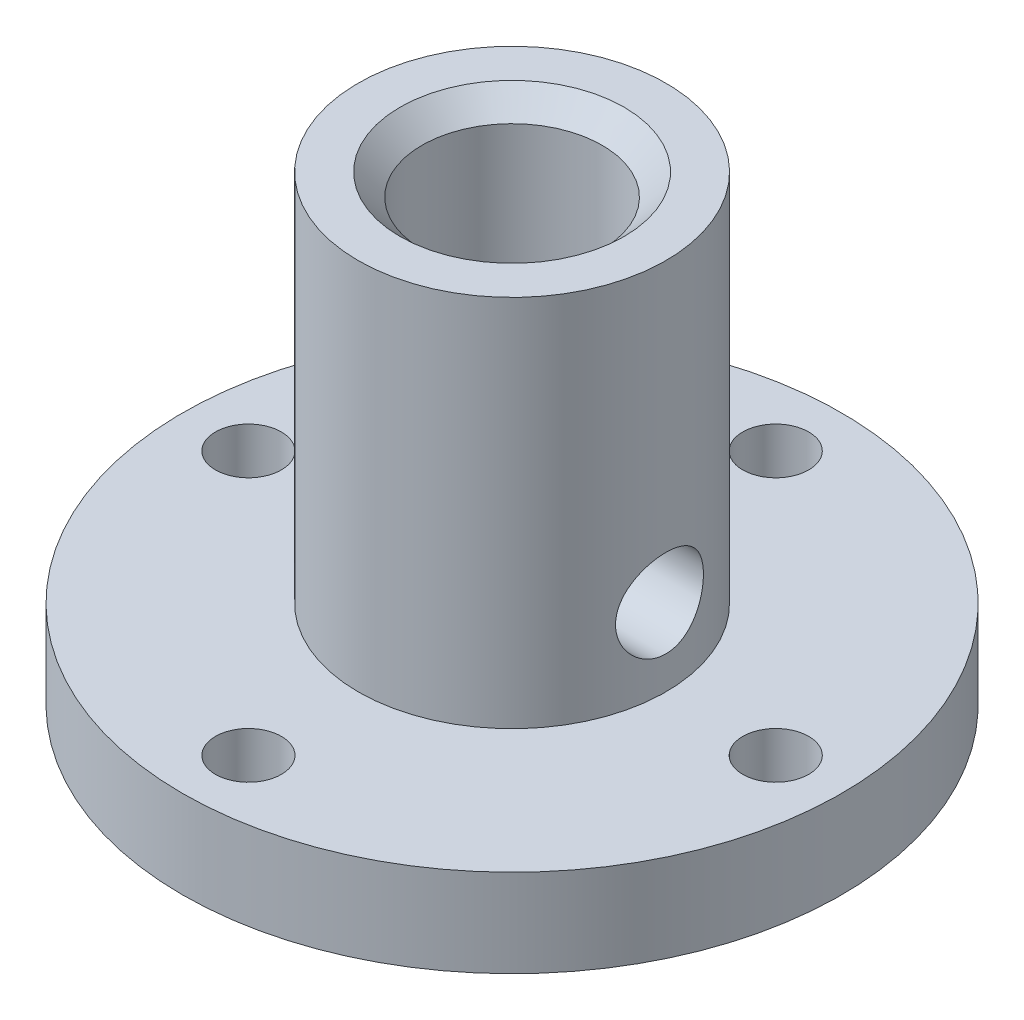
ISO-10303-21;
HEADER;
FILE_DESCRIPTION(('STEP AP214'),'2;1');
FILE_NAME('part.step','',(''),(''),'','','');
FILE_SCHEMA(('AUTOMOTIVE_DESIGN { 1 0 10303 214 1 1 1 1 }'));
ENDSEC;
DATA;
#1=APPLICATION_CONTEXT('core data for automotive mechanical design processes');
#2=APPLICATION_PROTOCOL_DEFINITION('international standard','automotive_design',2000,#1);
#3=PRODUCT_CONTEXT('',#1,'mechanical');
#4=PRODUCT('Part','Part','',(#3));
#5=PRODUCT_RELATED_PRODUCT_CATEGORY('part','',(#4));
#6=PRODUCT_DEFINITION_FORMATION('','',#4);
#7=PRODUCT_DEFINITION_CONTEXT('part definition',#1,'design');
#8=PRODUCT_DEFINITION('design','',#6,#7);
#9=PRODUCT_DEFINITION_SHAPE('','',#8);
#10=(LENGTH_UNIT() NAMED_UNIT(*) SI_UNIT(.MILLI.,.METRE.));
#11=(NAMED_UNIT(*) PLANE_ANGLE_UNIT() SI_UNIT($,.RADIAN.));
#12=(NAMED_UNIT(*) SI_UNIT($,.STERADIAN.) SOLID_ANGLE_UNIT());
#13=UNCERTAINTY_MEASURE_WITH_UNIT(LENGTH_MEASURE(1.E-05),#10,'distance_accuracy_value','');
#14=(GEOMETRIC_REPRESENTATION_CONTEXT(3) GLOBAL_UNCERTAINTY_ASSIGNED_CONTEXT((#13)) GLOBAL_UNIT_ASSIGNED_CONTEXT((#10,
#11,#12)) REPRESENTATION_CONTEXT('',''));
#15=CARTESIAN_POINT('',(0.,0.,0.));
#16=DIRECTION('',(0.,0.,1.));
#17=DIRECTION('',(1.,0.,0.));
#18=AXIS2_PLACEMENT_3D('',#15,#16,#17);
#19=CARTESIAN_POINT('',(0.,4.,0.));
#20=DIRECTION('',(0.,1.,0.));
#21=DIRECTION('',(0.,0.,1.));
#22=AXIS2_PLACEMENT_3D('',#19,#20,#21);
#23=PLANE('',#22);
#24=CARTESIAN_POINT('',(12.,4.,1.25693328198353E-13));
#25=DIRECTION('',(0.,1.,0.));
#26=DIRECTION('',(0.,0.,1.));
#27=AXIS2_PLACEMENT_3D('',#24,#25,#26);
#28=CIRCLE('',#27,1.5);
#29=CARTESIAN_POINT('',(12.,4.,1.50000000000013));
#30=VERTEX_POINT('',#29);
#31=EDGE_CURVE('E263',#30,#30,#28,.T.);
#32=ORIENTED_EDGE('',*,*,#31,.F.);
#33=EDGE_LOOP('',(#32));
#34=FACE_BOUND('',#33,.T.);
#35=CARTESIAN_POINT('',(0.,4.,12.));
#36=DIRECTION('',(0.,1.,0.));
#37=DIRECTION('',(0.,0.,1.));
#38=AXIS2_PLACEMENT_3D('',#35,#36,#37);
#39=CIRCLE('',#38,1.5);
#40=CARTESIAN_POINT('',(0.,4.,13.5));
#41=VERTEX_POINT('',#40);
#42=EDGE_CURVE('E259',#41,#41,#39,.T.);
#43=ORIENTED_EDGE('',*,*,#42,.F.);
#44=EDGE_LOOP('',(#43));
#45=FACE_BOUND('',#44,.T.);
#46=CARTESIAN_POINT('',(-12.,4.,0.));
#47=DIRECTION('',(0.,1.,0.));
#48=DIRECTION('',(0.,0.,1.));
#49=AXIS2_PLACEMENT_3D('',#46,#47,#48);
#50=CIRCLE('',#49,1.5);
#51=CARTESIAN_POINT('',(-12.,4.,1.49999999999996));
#52=VERTEX_POINT('',#51);
#53=EDGE_CURVE('E249',#52,#52,#50,.T.);
#54=ORIENTED_EDGE('',*,*,#53,.F.);
#55=EDGE_LOOP('',(#54));
#56=FACE_BOUND('',#55,.T.);
#57=CARTESIAN_POINT('',(0.,4.,-12.));
#58=DIRECTION('',(0.,1.,0.));
#59=DIRECTION('',(0.,0.,1.));
#60=AXIS2_PLACEMENT_3D('',#57,#58,#59);
#61=CIRCLE('',#60,1.5);
#62=CARTESIAN_POINT('',(0.,4.,-10.5));
#63=VERTEX_POINT('',#62);
#64=EDGE_CURVE('E242',#63,#63,#61,.T.);
#65=ORIENTED_EDGE('',*,*,#64,.F.);
#66=EDGE_LOOP('',(#65));
#67=FACE_BOUND('',#66,.T.);
#68=CARTESIAN_POINT('',(0.,4.,0.));
#69=DIRECTION('',(0.,1.,0.));
#70=DIRECTION('',(0.,0.,1.));
#71=AXIS2_PLACEMENT_3D('',#68,#69,#70);
#72=CIRCLE('',#71,15.);
#73=CARTESIAN_POINT('',(0.,4.,15.));
#74=VERTEX_POINT('',#73);
#75=EDGE_CURVE('E62',#74,#74,#72,.T.);
#76=ORIENTED_EDGE('',*,*,#75,.T.);
#77=EDGE_LOOP('',(#76));
#78=FACE_BOUND('',#77,.T.);
#79=CARTESIAN_POINT('',(0.,4.,0.));
#80=DIRECTION('',(0.,1.,0.));
#81=DIRECTION('',(0.,0.,1.));
#82=AXIS2_PLACEMENT_3D('',#79,#80,#81);
#83=CIRCLE('',#82,7.);
#84=CARTESIAN_POINT('',(0.,4.,7.));
#85=VERTEX_POINT('',#84);
#86=EDGE_CURVE('E102',#85,#85,#83,.T.);
#87=ORIENTED_EDGE('',*,*,#86,.F.);
#88=EDGE_LOOP('',(#87));
#89=FACE_BOUND('',#88,.T.);
#90=ADVANCED_FACE('F49',(#34,#45,#56,#67,#78,#89),#23,.T.);
#91=CARTESIAN_POINT('',(0.,0.,0.));
#92=DIRECTION('',(0.,1.,0.));
#93=DIRECTION('',(0.,0.,1.));
#94=AXIS2_PLACEMENT_3D('',#91,#92,#93);
#95=PLANE('',#94);
#96=CARTESIAN_POINT('',(12.,0.,1.25693328198353E-13));
#97=DIRECTION('',(0.,1.,0.));
#98=DIRECTION('',(0.,0.,1.));
#99=AXIS2_PLACEMENT_3D('',#96,#97,#98);
#100=CIRCLE('',#99,1.5);
#101=CARTESIAN_POINT('',(12.,0.,1.50000000000013));
#102=VERTEX_POINT('',#101);
#103=EDGE_CURVE('E80',#102,#102,#100,.T.);
#104=ORIENTED_EDGE('',*,*,#103,.T.);
#105=EDGE_LOOP('',(#104));
#106=FACE_BOUND('',#105,.T.);
#107=CARTESIAN_POINT('',(0.,0.,12.));
#108=DIRECTION('',(0.,1.,0.));
#109=DIRECTION('',(0.,0.,1.));
#110=AXIS2_PLACEMENT_3D('',#107,#108,#109);
#111=CIRCLE('',#110,1.5);
#112=CARTESIAN_POINT('',(0.,0.,13.5));
#113=VERTEX_POINT('',#112);
#114=EDGE_CURVE('E255',#113,#113,#111,.T.);
#115=ORIENTED_EDGE('',*,*,#114,.T.);
#116=EDGE_LOOP('',(#115));
#117=FACE_BOUND('',#116,.T.);
#118=CARTESIAN_POINT('',(-12.,0.,0.));
#119=DIRECTION('',(0.,1.,0.));
#120=DIRECTION('',(0.,0.,1.));
#121=AXIS2_PLACEMENT_3D('',#118,#119,#120);
#122=CIRCLE('',#121,1.5);
#123=CARTESIAN_POINT('',(-12.,0.,1.49999999999996));
#124=VERTEX_POINT('',#123);
#125=EDGE_CURVE('E245',#124,#124,#122,.T.);
#126=ORIENTED_EDGE('',*,*,#125,.T.);
#127=EDGE_LOOP('',(#126));
#128=FACE_BOUND('',#127,.T.);
#129=CARTESIAN_POINT('',(0.,0.,-12.));
#130=DIRECTION('',(0.,1.,0.));
#131=DIRECTION('',(0.,0.,1.));
#132=AXIS2_PLACEMENT_3D('',#129,#130,#131);
#133=CIRCLE('',#132,1.5);
#134=CARTESIAN_POINT('',(0.,0.,-10.5));
#135=VERTEX_POINT('',#134);
#136=EDGE_CURVE('E103',#135,#135,#133,.T.);
#137=ORIENTED_EDGE('',*,*,#136,.T.);
#138=EDGE_LOOP('',(#137));
#139=FACE_BOUND('',#138,.T.);
#140=CARTESIAN_POINT('',(0.,0.,0.));
#141=DIRECTION('',(0.,1.,0.));
#142=DIRECTION('',(0.,0.,1.));
#143=AXIS2_PLACEMENT_3D('',#140,#141,#142);
#144=CIRCLE('',#143,15.);
#145=CARTESIAN_POINT('',(0.,0.,15.));
#146=VERTEX_POINT('',#145);
#147=EDGE_CURVE('E67',#146,#146,#144,.T.);
#148=ORIENTED_EDGE('',*,*,#147,.F.);
#149=EDGE_LOOP('',(#148));
#150=FACE_BOUND('',#149,.T.);
#151=CARTESIAN_POINT('',(0.,0.,0.));
#152=DIRECTION('',(0.,1.,0.));
#153=DIRECTION('',(0.,0.,1.));
#154=AXIS2_PLACEMENT_3D('',#151,#152,#153);
#155=CIRCLE('',#154,4.1);
#156=CARTESIAN_POINT('',(0.,0.,4.1));
#157=VERTEX_POINT('',#156);
#158=EDGE_CURVE('E129',#157,#157,#155,.T.);
#159=ORIENTED_EDGE('',*,*,#158,.T.);
#160=EDGE_LOOP('',(#159));
#161=FACE_BOUND('',#160,.T.);
#162=ADVANCED_FACE('F114',(#106,#117,#128,#139,#150,#161),#95,.F.);
#163=CARTESIAN_POINT('',(0.,4.,0.));
#164=DIRECTION('',(0.,-1.,0.));
#165=DIRECTION('',(0.,0.,-1.));
#166=AXIS2_PLACEMENT_3D('',#163,#164,#165);
#167=CYLINDRICAL_SURFACE('',#166,15.);
#168=ORIENTED_EDGE('',*,*,#75,.F.);
#169=EDGE_LOOP('',(#168));
#170=FACE_BOUND('',#169,.T.);
#171=ORIENTED_EDGE('',*,*,#147,.T.);
#172=EDGE_LOOP('',(#171));
#173=FACE_BOUND('',#172,.T.);
#174=ADVANCED_FACE('F111',(#170,#173),#167,.T.);
#175=CARTESIAN_POINT('',(0.,4.,0.));
#176=DIRECTION('',(0.,-1.,0.));
#177=DIRECTION('',(0.,0.,-1.));
#178=AXIS2_PLACEMENT_3D('',#175,#176,#177);
#179=CYLINDRICAL_SURFACE('',#178,4.1);
#180=CARTESIAN_POINT('',(0.,20.,0.));
#181=DIRECTION('',(0.,1.,0.));
#182=DIRECTION('',(0.,0.,1.));
#183=AXIS2_PLACEMENT_3D('',#180,#181,#182);
#184=CIRCLE('',#183,4.1);
#185=CARTESIAN_POINT('',(0.,20.,4.1));
#186=VERTEX_POINT('',#185);
#187=EDGE_CURVE('E57',#186,#186,#184,.T.);
#188=ORIENTED_EDGE('',*,*,#187,.T.);
#189=EDGE_LOOP('',(#188));
#190=FACE_BOUND('',#189,.T.);
#191=CARTESIAN_POINT('',(3.57910603363466,7.5,2.));
#192=CARTESIAN_POINT('',(3.57911549351938,7.60460313127252,1.99999203521137));
#193=CARTESIAN_POINT('',(3.58376125840516,7.70935110339454,1.99173874982166));
#194=CARTESIAN_POINT('',(3.60168515917494,7.91566130495392,1.95912946894205));
#195=CARTESIAN_POINT('',(3.61498231102066,8.01721599877448,1.93473799932171));
#196=CARTESIAN_POINT('',(3.64830431376547,8.21377250616725,1.87113477427495));
#197=CARTESIAN_POINT('',(3.66829469181402,8.30880494978369,1.83199883213511));
#198=CARTESIAN_POINT('',(3.71269796582502,8.49093185949433,1.74024799841703));
#199=CARTESIAN_POINT('',(3.73711091358427,8.5780262326005,1.68763294896955));
#200=CARTESIAN_POINT('',(3.78994762967,8.74934330237854,1.56558293033315));
#201=CARTESIAN_POINT('',(3.81853577179174,8.83280721222689,1.49515355486));
#202=CARTESIAN_POINT('',(3.87517206142575,8.98732403060545,1.34154519168277));
#203=CARTESIAN_POINT('',(3.90321994472343,9.05837099717957,1.25836013547559));
#204=CARTESIAN_POINT('',(3.95774408872127,9.19043951249541,1.07515162671652));
#205=CARTESIAN_POINT('',(3.98400796365301,9.25053985458591,0.974394981339268));
#206=CARTESIAN_POINT('',(4.02989043804658,9.35259316855004,0.762680850328952));
#207=CARTESIAN_POINT('',(4.04951303191397,9.39455705283757,0.651729547528795));
#208=CARTESIAN_POINT('',(4.07872062370044,9.4561813505541,0.430804292426906));
#209=CARTESIAN_POINT('',(4.08889945801618,9.4771688968046,0.321280788621115));
#210=CARTESIAN_POINT('',(4.10028036474683,9.5006026099949,0.0998294816190987));
#211=CARTESIAN_POINT('',(4.10148757147755,9.50305938180604,-0.01209690965444));
#212=CARTESIAN_POINT('',(4.09508161202062,9.48990297628252,-0.225251375571962));
#213=CARTESIAN_POINT('',(4.08819107596985,9.47577033524335,-0.326597393919667));
#214=CARTESIAN_POINT('',(4.06744064579331,9.43246824246255,-0.525265987252532));
#215=CARTESIAN_POINT('',(4.05358023200027,9.40329766950335,-0.622588261645648));
#216=CARTESIAN_POINT('',(4.01992124886936,9.33052427018978,-0.812185586111151));
#217=CARTESIAN_POINT('',(4.0000405126708,9.28672081777833,-0.904368438528104));
#218=CARTESIAN_POINT('',(3.95615659362404,9.1861846505913,-1.08030473735587));
#219=CARTESIAN_POINT('',(3.93215191572606,9.12944724443096,-1.16405510921946));
#220=CARTESIAN_POINT('',(3.87971757201288,8.99870432864888,-1.32888526806237));
#221=CARTESIAN_POINT('',(3.85108400972904,8.92359657959063,-1.40902672648122));
#222=CARTESIAN_POINT('',(3.79405881442221,8.76121417466934,-1.55606875729569));
#223=CARTESIAN_POINT('',(3.76566736542168,8.67393101134308,-1.6229599914329));
#224=CARTESIAN_POINT('',(3.71057327831189,8.4834283131435,-1.74539879244378));
#225=CARTESIAN_POINT('',(3.68406522126376,8.37957678754232,-1.80005910768764));
#226=CARTESIAN_POINT('',(3.6383756600965,8.16254531299001,-1.89072122831643));
#227=CARTESIAN_POINT('',(3.61918683229938,8.04937482729991,-1.92674169782092));
#228=CARTESIAN_POINT('',(3.5923718224711,7.8262170381446,-1.97626037678829));
#229=CARTESIAN_POINT('',(3.58396173722362,7.71666788748898,-1.99129373139044));
#230=CARTESIAN_POINT('',(3.57741810990285,7.49631416397176,-2.00303207769182));
#231=CARTESIAN_POINT('',(3.57927807326091,7.3855104287216,-1.99974865253435));
#232=CARTESIAN_POINT('',(3.59223528636872,7.17777840015293,-1.97635544891226));
#233=CARTESIAN_POINT('',(3.60237445078161,7.08058447947523,-1.95798980802438));
#234=CARTESIAN_POINT('',(3.6293610990874,6.89082470684055,-1.90749863988995));
#235=CARTESIAN_POINT('',(3.64621063043137,6.79826027713433,-1.87536891275174));
#236=CARTESIAN_POINT('',(3.68564393156237,6.61551488543606,-1.79667570758733));
#237=CARTESIAN_POINT('',(3.70845762353666,6.52564414575372,-1.74951132085546));
#238=CARTESIAN_POINT('',(3.75702564086069,6.35458219102223,-1.64262069707828));
#239=CARTESIAN_POINT('',(3.78278145981906,6.27339542536318,-1.58288806653124));
#240=CARTESIAN_POINT('',(3.83801172380996,6.11192249694563,-1.44425233541737));
#241=CARTESIAN_POINT('',(3.86756445509084,6.03288901011393,-1.36391485049048));
#242=CARTESIAN_POINT('',(3.92438084705234,5.88905777574575,-1.1906082774667));
#243=CARTESIAN_POINT('',(3.95164384841493,5.82426411988422,-1.09763557115075));
#244=CARTESIAN_POINT('',(4.0015960231227,5.70961039790442,-0.898856284576327));
#245=CARTESIAN_POINT('',(4.02417294714763,5.66010539262237,-0.79281474568715));
#246=CARTESIAN_POINT('',(4.06136575959817,5.58011586984284,-0.572492505839614));
#247=CARTESIAN_POINT('',(4.07598830059589,5.54961545492327,-0.458218780662893));
#248=CARTESIAN_POINT('',(4.09460950167294,5.51100997434092,-0.235637779143147));
#249=CARTESIAN_POINT('',(4.09943655344915,5.50115608424858,-0.127702309747682));
#250=CARTESIAN_POINT('',(4.10046910319513,5.49903732350476,0.0883674499714201));
#251=CARTESIAN_POINT('',(4.09667733157617,5.50676688248247,0.196501666488732));
#252=CARTESIAN_POINT('',(4.081380862921,5.53840850821583,0.403000999714159));
#253=CARTESIAN_POINT('',(4.07035869803276,5.56130900695535,0.501560522153557));
#254=CARTESIAN_POINT('',(4.04212024074726,5.6213208863698,0.69329740677902));
#255=CARTESIAN_POINT('',(4.02490301779979,5.6584344020142,0.786473957955667));
#256=CARTESIAN_POINT('',(3.98490151452439,5.74754675796046,0.969387107444829));
#257=CARTESIAN_POINT('',(3.96190565673567,5.80012858458626,1.05879207441146));
#258=CARTESIAN_POINT('',(3.91280606992116,5.91793833015936,1.22789007126321));
#259=CARTESIAN_POINT('',(3.88670091268204,5.98317206929789,1.30757860376514));
#260=CARTESIAN_POINT('',(3.83108076584123,6.13166030819632,1.46296322006605));
#261=CARTESIAN_POINT('',(3.80147771479893,6.21603903377536,1.53755746285946));
#262=CARTESIAN_POINT('',(3.74434364653043,6.39661515273092,1.67189420349916));
#263=CARTESIAN_POINT('',(3.71681432796668,6.49282206878541,1.73162461618753));
#264=CARTESIAN_POINT('',(3.66655946796521,6.69769988709364,1.83569855861032));
#265=CARTESIAN_POINT('',(3.64396779323184,6.80661796714086,1.87963029930495));
#266=CARTESIAN_POINT('',(3.61694115748607,6.97525215827044,1.93082838173293));
#267=CARTESIAN_POINT('',(3.60907981766962,7.0322852370427,1.94543783106175));
#268=CARTESIAN_POINT('',(3.59594892415105,7.14769087021839,1.969605058563));
#269=CARTESIAN_POINT('',(3.59067752771889,7.20606244125187,1.97916642877747));
#270=CARTESIAN_POINT('',(3.58426923449856,7.3037857828507,1.99073876092795));
#271=CARTESIAN_POINT('',(3.58233773716366,7.34292007089391,1.99420822373664));
#272=CARTESIAN_POINT('',(3.57975431873891,7.42136274052758,1.99884041200608));
#273=CARTESIAN_POINT('',(3.57910247689074,7.46067113274827,2.00000299461509));
#274=CARTESIAN_POINT('',(3.57910603363466,7.5,2.));
#275=B_SPLINE_CURVE_WITH_KNOTS('',3,(#191,#192,#193,#194,#195,#196,#197,#198,#199,#200,#201,
#202,#203,#204,#205,#206,#207,#208,#209,#210,#211,#212,#213,#214,#215,#216,#217,#218,#219,#220,
#221,#222,#223,#224,#225,#226,#227,#228,#229,#230,#231,#232,#233,#234,#235,#236,#237,#238,#239,
#240,#241,#242,#243,#244,#245,#246,#247,#248,#249,#250,#251,#252,#253,#254,#255,#256,#257,#258,
#259,#260,#261,#262,#263,#264,#265,#266,#267,#268,#269,#270,#271,#272,#273,#274),.UNSPECIFIED.,
.T.,.F.,(4,2,2,2,2,2,2,2,2,2,2,2,2,2,2,2,2,2,2,2,2,2,2,2,2,2,2,2,2,2,2,2,2,2,2,2,2,2,2,2,2,4),
(0.,0.313650890541303,0.627993533225417,0.940741468656521,1.25349306720364,1.5907325199367,
1.92813291467276,2.28692480669026,2.64550051785586,2.97959497055994,3.31349821173604,
3.61973181129304,3.9259882467137,4.23662887726973,4.54738236272926,4.88644508088654,
5.22574591406521,5.58480245391705,5.94349877057147,6.27426859261931,6.6048292665636,
6.90179199962346,7.19884541074499,7.50969135282915,7.82069580710552,8.16864543025316,
8.51669490295158,8.87230668332232,9.22762059213174,9.55136951175941,9.87501588322538,
10.1790016024625,10.4830330020053,10.8004387428756,11.1179908460248,11.4657662790126,
11.8138235565093,12.1703884153887,12.3483459844256,12.5261767536391,12.6440964591989,
12.7620234666165),.UNSPECIFIED.);
#276=CARTESIAN_POINT('',(3.57910603363466,7.5,2.));
#277=VERTEX_POINT('',#276);
#278=EDGE_CURVE('E79',#277,#277,#275,.T.);
#279=ORIENTED_EDGE('',*,*,#278,.F.);
#280=EDGE_LOOP('',(#279));
#281=FACE_BOUND('',#280,.T.);
#282=ORIENTED_EDGE('',*,*,#158,.F.);
#283=EDGE_LOOP('',(#282));
#284=FACE_BOUND('',#283,.T.);
#285=ADVANCED_FACE('F107',(#190,#281,#284),#179,.F.);
#286=CARTESIAN_POINT('',(0.,21.,0.));
#287=DIRECTION('',(0.,1.,0.));
#288=DIRECTION('',(0.,0.,1.));
#289=AXIS2_PLACEMENT_3D('',#286,#287,#288);
#290=PLANE('',#289);
#291=CARTESIAN_POINT('',(0.,21.,0.));
#292=DIRECTION('',(0.,1.,0.));
#293=DIRECTION('',(0.,0.,1.));
#294=AXIS2_PLACEMENT_3D('',#291,#292,#293);
#295=CIRCLE('',#294,5.10000000000001);
#296=CARTESIAN_POINT('',(0.,21.,5.10000000000001));
#297=VERTEX_POINT('',#296);
#298=EDGE_CURVE('E11',#297,#297,#295,.F.);
#299=ORIENTED_EDGE('',*,*,#298,.T.);
#300=EDGE_LOOP('',(#299));
#301=FACE_BOUND('',#300,.T.);
#302=CARTESIAN_POINT('',(0.,21.,0.));
#303=DIRECTION('',(0.,1.,0.));
#304=DIRECTION('',(0.,0.,1.));
#305=AXIS2_PLACEMENT_3D('',#302,#303,#304);
#306=CIRCLE('',#305,7.);
#307=CARTESIAN_POINT('',(0.,21.,7.));
#308=VERTEX_POINT('',#307);
#309=EDGE_CURVE('E105',#308,#308,#306,.T.);
#310=ORIENTED_EDGE('',*,*,#309,.T.);
#311=EDGE_LOOP('',(#310));
#312=FACE_BOUND('',#311,.T.);
#313=ADVANCED_FACE('F92',(#301,#312),#290,.T.);
#314=CARTESIAN_POINT('',(0.,21.,0.));
#315=DIRECTION('',(0.,-1.,0.));
#316=DIRECTION('',(0.,0.,-1.));
#317=AXIS2_PLACEMENT_3D('',#314,#315,#316);
#318=CYLINDRICAL_SURFACE('',#317,7.);
#319=CARTESIAN_POINT('',(6.70820393249937,7.5,2.));
#320=CARTESIAN_POINT('',(6.70820547009708,7.60985153787724,1.99999802046393));
#321=CARTESIAN_POINT('',(6.71093179679208,7.71972308425451,1.9909186659955));
#322=CARTESIAN_POINT('',(6.72150389207102,7.93627123886298,1.95492363390195));
#323=CARTESIAN_POINT('',(6.72935174296489,8.04294652910063,1.92800070136334));
#324=CARTESIAN_POINT('',(6.74920709521546,8.2499372008715,1.85729343292867));
#325=CARTESIAN_POINT('',(6.76120815257369,8.35026215181714,1.81353520651874));
#326=CARTESIAN_POINT('',(6.78800921096146,8.54216781155437,1.71048364062938));
#327=CARTESIAN_POINT('',(6.80280954425194,8.63374748037804,1.65118845666347));
#328=CARTESIAN_POINT('',(6.83401783214154,8.80819156531483,1.51692480098199));
#329=CARTESIAN_POINT('',(6.8504575596415,8.89076780212922,1.4415892111325));
#330=CARTESIAN_POINT('',(6.88281965512018,9.04230278330379,1.27817124546927));
#331=CARTESIAN_POINT('',(6.89874196233652,9.11125993312284,1.19008737915963));
#332=CARTESIAN_POINT('',(6.92863332001512,9.23482864835352,1.00164603215759));
#333=CARTESIAN_POINT('',(6.94256054500866,9.28914961975098,0.901090783761869));
#334=CARTESIAN_POINT('',(6.96652540485531,9.38000177441597,0.691808475239642));
#335=CARTESIAN_POINT('',(6.97656379690866,9.41653642124027,0.583083010875174));
#336=CARTESIAN_POINT('',(6.99139519300235,9.46983446123971,0.36355857512118));
#337=CARTESIAN_POINT('',(6.99631827011303,9.48708902170467,0.252887798129042));
#338=CARTESIAN_POINT('',(7.00082095659694,9.50288673388324,0.0301201024219257));
#339=CARTESIAN_POINT('',(7.00040158738982,9.50143346233736,-0.0819765395885465));
#340=CARTESIAN_POINT('',(6.99436006763307,9.48019362508198,-0.300980195735219));
#341=CARTESIAN_POINT('',(6.98888870776051,9.46093838736202,-0.407943546108944));
#342=CARTESIAN_POINT('',(6.97353886330137,9.40550489753563,-0.617052222177616));
#343=CARTESIAN_POINT('',(6.96366011056224,9.36932561573788,-0.719197254300508));
#344=CARTESIAN_POINT('',(6.94039031772111,9.28069059918818,-0.917073833728922));
#345=CARTESIAN_POINT('',(6.92696205512133,9.22806122219167,-1.01272304385077));
#346=CARTESIAN_POINT('',(6.89802768974041,9.10815541360198,-1.19400724359048));
#347=CARTESIAN_POINT('',(6.8825211319195,9.04087577233352,-1.27964003241601));
#348=CARTESIAN_POINT('',(6.85045683019623,8.89079428938141,-1.44163264854775));
#349=CARTESIAN_POINT('',(6.83388129369387,8.80753056639495,-1.51756157758489));
#350=CARTESIAN_POINT('',(6.80202973786992,8.62928490815404,-1.65449301574976));
#351=CARTESIAN_POINT('',(6.78675382405366,8.534302023051,-1.71549431378261));
#352=CARTESIAN_POINT('',(6.75915174814409,8.33426911550201,-1.82123335985447));
#353=CARTESIAN_POINT('',(6.74685010938643,8.22914477494834,-1.86583737788771));
#354=CARTESIAN_POINT('',(6.72688544387341,8.01244683649538,-1.9365895149609));
#355=CARTESIAN_POINT('',(6.71922106753542,7.90087512534009,-1.9627430040271));
#356=CARTESIAN_POINT('',(6.70969115196194,7.67851957566769,-1.99507417199885));
#357=CARTESIAN_POINT('',(6.70763711316669,7.56783818306699,-2.00190148157354));
#358=CARTESIAN_POINT('',(6.7090415959684,7.34691168407904,-1.99718996719665));
#359=CARTESIAN_POINT('',(6.71249942992568,7.23666652498908,-1.98565343424642));
#360=CARTESIAN_POINT('',(6.72435430053723,7.02235877197705,-1.94511781425928));
#361=CARTESIAN_POINT('',(6.73263642965451,6.91821241398484,-1.9165246218414));
#362=CARTESIAN_POINT('',(6.75309063930731,6.71619812800227,-1.84315161866429));
#363=CARTESIAN_POINT('',(6.7652632811114,6.61833110835435,-1.79836947226768));
#364=CARTESIAN_POINT('',(6.79250188009389,6.42897792478326,-1.69261965121623));
#365=CARTESIAN_POINT('',(6.80763197381122,6.33770955579781,-1.63127891729131));
#366=CARTESIAN_POINT('',(6.83893726549831,6.16652362655664,-1.49460463684842));
#367=CARTESIAN_POINT('',(6.85511268947611,6.08660853298787,-1.41926805768137));
#368=CARTESIAN_POINT('',(6.88734727436087,5.93762058171182,-1.25370800996556));
#369=CARTESIAN_POINT('',(6.90338406046143,5.86900502858127,-1.16306771024055));
#370=CARTESIAN_POINT('',(6.93297977045999,5.74795431861727,-0.971185307057546));
#371=CARTESIAN_POINT('',(6.94653882385412,5.69551831607762,-0.869943758098184));
#372=CARTESIAN_POINT('',(6.96956504846406,5.60881571297367,-0.660433272956167));
#373=CARTESIAN_POINT('',(6.97906308127248,5.57441161041385,-0.552224799899635));
#374=CARTESIAN_POINT('',(6.99303339623885,5.52437319805982,-0.331245648549923));
#375=CARTESIAN_POINT('',(6.99750697123019,5.50873405981868,-0.218476151585438));
#376=CARTESIAN_POINT('',(7.00085335003284,5.49700856600221,0.00417823795902836));
#377=CARTESIAN_POINT('',(6.99991703588995,5.50025585091718,0.114025631049956));
#378=CARTESIAN_POINT('',(6.99299069122135,5.52463828141029,0.331545172422003));
#379=CARTESIAN_POINT('',(6.98700090270593,5.54577257038204,0.439217424617531));
#380=CARTESIAN_POINT('',(6.97068801860116,5.60493136097885,0.648404133039587));
#381=CARTESIAN_POINT('',(6.96040414048174,5.64280317894398,0.749965033435049));
#382=CARTESIAN_POINT('',(6.93657094143453,5.73422615828548,0.945347202761461));
#383=CARTESIAN_POINT('',(6.92302111501785,5.78777974709225,1.03916727058068));
#384=CARTESIAN_POINT('',(6.89358955440188,5.91089733742482,1.21943345635391));
#385=CARTESIAN_POINT('',(6.8776504578623,5.98089008678841,1.30557732800707));
#386=CARTESIAN_POINT('',(6.84544064986529,6.13410912545394,1.46512122231839));
#387=CARTESIAN_POINT('',(6.82916984787116,6.21733907108483,1.5385177121898));
#388=CARTESIAN_POINT('',(6.79764037543869,6.39729691699546,1.67240846029126));
#389=CARTESIAN_POINT('',(6.78241951768489,6.49432194750348,1.73251316723594));
#390=CARTESIAN_POINT('',(6.7552844533164,6.69752186531463,1.83547943619619));
#391=CARTESIAN_POINT('',(6.74336839719835,6.80369159108834,1.8783506488486));
#392=CARTESIAN_POINT('',(6.72558459556592,7.00765370023266,1.94098534012467));
#393=CARTESIAN_POINT('',(6.71912438833989,7.10469034810252,1.96305899981724));
#394=CARTESIAN_POINT('',(6.71043369466525,7.30114611835192,1.99256607043695));
#395=CARTESIAN_POINT('',(6.70820254070055,7.4005648622311,2.00000179183146));
#396=CARTESIAN_POINT('',(6.70820393249937,7.5,2.));
#397=B_SPLINE_CURVE_WITH_KNOTS('',3,(#319,#320,#321,#322,#323,#324,#325,#326,#327,#328,#329,
#330,#331,#332,#333,#334,#335,#336,#337,#338,#339,#340,#341,#342,#343,#344,#345,#346,#347,#348,
#349,#350,#351,#352,#353,#354,#355,#356,#357,#358,#359,#360,#361,#362,#363,#364,#365,#366,#367,
#368,#369,#370,#371,#372,#373,#374,#375,#376,#377,#378,#379,#380,#381,#382,#383,#384,#385,#386,
#387,#388,#389,#390,#391,#392,#393,#394,#395,#396),.UNSPECIFIED.,.T.,.F.,(4,2,2,2,2,2,2,2,2,2,2,
2,2,2,2,2,2,2,2,2,2,2,2,2,2,2,2,2,2,2,2,2,2,2,2,2,2,2,4),(0.,0.329188342363952,
0.658510609618862,0.987324183736437,1.31617681100735,1.65357167206616,1.99100601238483,
2.33471483013846,2.67835669017706,3.01302901028742,3.34763734552418,3.67257037643421,
3.99752317946522,4.32602903378491,4.65460693184835,4.99471612693,5.3348529062976,
5.67770520630006,6.02045767793012,6.35154363333481,6.6825882869845,7.00605289656512,
7.32956419216041,7.66108006042382,7.99266784620105,8.33545388376657,8.67822200084648,
9.0183368529809,9.35836417076638,9.6864689768406,10.0145580709057,10.3397141238921,
10.6649205354322,10.9997976874537,11.3347674991531,11.6785361242131,12.0221119721565,
12.3201328886649,12.61810676147),.UNSPECIFIED.);
#398=CARTESIAN_POINT('',(6.70820393249937,7.5,2.));
#399=VERTEX_POINT('',#398);
#400=EDGE_CURVE('E70',#399,#399,#397,.T.);
#401=ORIENTED_EDGE('',*,*,#400,.T.);
#402=EDGE_LOOP('',(#401));
#403=FACE_BOUND('',#402,.T.);
#404=ORIENTED_EDGE('',*,*,#309,.F.);
#405=EDGE_LOOP('',(#404));
#406=FACE_BOUND('',#405,.T.);
#407=ORIENTED_EDGE('',*,*,#86,.T.);
#408=EDGE_LOOP('',(#407));
#409=FACE_BOUND('',#408,.T.);
#410=ADVANCED_FACE('F81',(#403,#406,#409),#318,.T.);
#411=CARTESIAN_POINT('',(12.,7.5,0.));
#412=DIRECTION('',(-1.,0.,0.));
#413=DIRECTION('',(0.,0.,1.));
#414=AXIS2_PLACEMENT_3D('',#411,#412,#413);
#415=CYLINDRICAL_SURFACE('',#414,2.);
#416=ORIENTED_EDGE('',*,*,#278,.T.);
#417=EDGE_LOOP('',(#416));
#418=FACE_BOUND('',#417,.T.);
#419=ORIENTED_EDGE('',*,*,#400,.F.);
#420=EDGE_LOOP('',(#419));
#421=FACE_BOUND('',#420,.T.);
#422=ADVANCED_FACE('F85',(#418,#421),#415,.F.);
#423=CARTESIAN_POINT('',(0.,0.,-12.));
#424=DIRECTION('',(0.,1.,0.));
#425=DIRECTION('',(0.,0.,1.));
#426=AXIS2_PLACEMENT_3D('',#423,#424,#425);
#427=CYLINDRICAL_SURFACE('',#426,1.5);
#428=ORIENTED_EDGE('',*,*,#136,.F.);
#429=EDGE_LOOP('',(#428));
#430=FACE_BOUND('',#429,.T.);
#431=ORIENTED_EDGE('',*,*,#64,.T.);
#432=EDGE_LOOP('',(#431));
#433=FACE_BOUND('',#432,.T.);
#434=ADVANCED_FACE('F89',(#430,#433),#427,.F.);
#435=CARTESIAN_POINT('',(-12.,0.,0.));
#436=DIRECTION('',(0.,1.,0.));
#437=DIRECTION('',(0.,0.,1.));
#438=AXIS2_PLACEMENT_3D('',#435,#436,#437);
#439=CYLINDRICAL_SURFACE('',#438,1.5);
#440=ORIENTED_EDGE('',*,*,#125,.F.);
#441=EDGE_LOOP('',(#440));
#442=FACE_BOUND('',#441,.T.);
#443=ORIENTED_EDGE('',*,*,#53,.T.);
#444=EDGE_LOOP('',(#443));
#445=FACE_BOUND('',#444,.T.);
#446=ADVANCED_FACE('F183',(#442,#445),#439,.F.);
#447=CARTESIAN_POINT('',(0.,0.,12.));
#448=DIRECTION('',(0.,1.,0.));
#449=DIRECTION('',(0.,0.,1.));
#450=AXIS2_PLACEMENT_3D('',#447,#448,#449);
#451=CYLINDRICAL_SURFACE('',#450,1.5);
#452=ORIENTED_EDGE('',*,*,#114,.F.);
#453=EDGE_LOOP('',(#452));
#454=FACE_BOUND('',#453,.T.);
#455=ORIENTED_EDGE('',*,*,#42,.T.);
#456=EDGE_LOOP('',(#455));
#457=FACE_BOUND('',#456,.T.);
#458=ADVANCED_FACE('F173',(#454,#457),#451,.F.);
#459=CARTESIAN_POINT('',(12.,0.,1.25693328198353E-13));
#460=DIRECTION('',(0.,1.,0.));
#461=DIRECTION('',(0.,0.,1.));
#462=AXIS2_PLACEMENT_3D('',#459,#460,#461);
#463=CYLINDRICAL_SURFACE('',#462,1.5);
#464=ORIENTED_EDGE('',*,*,#103,.F.);
#465=EDGE_LOOP('',(#464));
#466=FACE_BOUND('',#465,.T.);
#467=ORIENTED_EDGE('',*,*,#31,.T.);
#468=EDGE_LOOP('',(#467));
#469=FACE_BOUND('',#468,.T.);
#470=ADVANCED_FACE('F162',(#466,#469),#463,.F.);
#471=CARTESIAN_POINT('',(0.,20.,0.));
#472=DIRECTION('',(0.,1.,0.));
#473=DIRECTION('',(0.,0.,1.));
#474=AXIS2_PLACEMENT_3D('',#471,#472,#473);
#475=CONICAL_SURFACE('',#474,4.1,0.785398163397448);
#476=ORIENTED_EDGE('',*,*,#298,.F.);
#477=EDGE_LOOP('',(#476));
#478=FACE_BOUND('',#477,.T.);
#479=ORIENTED_EDGE('',*,*,#187,.F.);
#480=EDGE_LOOP('',(#479));
#481=FACE_BOUND('',#480,.T.);
#482=ADVANCED_FACE('F51',(#478,#481),#475,.F.);
#483=CLOSED_SHELL('',(#90,#162,#174,#285,#313,#410,#422,#434,#446,#458,#470,#482));
#484=MANIFOLD_SOLID_BREP('B2',#483);
#485=ADVANCED_BREP_SHAPE_REPRESENTATION('',(#18,#484),#14);
#486=SHAPE_DEFINITION_REPRESENTATION(#9,#485);
ENDSEC;
END-ISO-10303-21;
